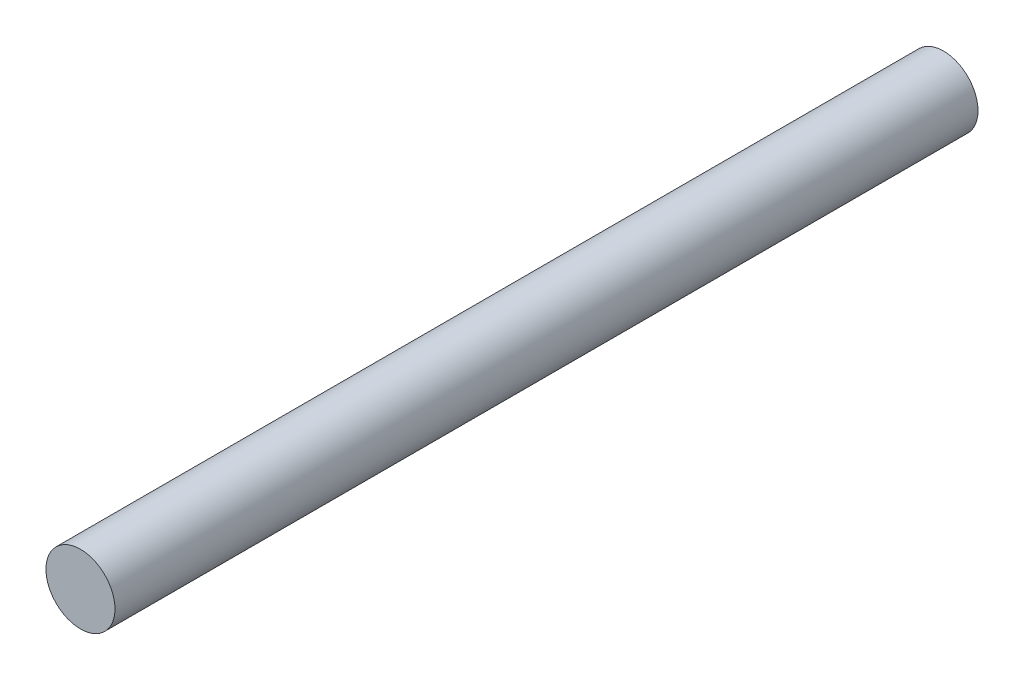
ISO-10303-21;
HEADER;
FILE_DESCRIPTION(('STEP AP214'),'2;1');
FILE_NAME('part.step','',(''),(''),'','','');
FILE_SCHEMA(('AUTOMOTIVE_DESIGN { 1 0 10303 214 1 1 1 1 }'));
ENDSEC;
DATA;
#1=APPLICATION_CONTEXT('core data for automotive mechanical design processes');
#2=APPLICATION_PROTOCOL_DEFINITION('international standard','automotive_design',2000,#1);
#3=PRODUCT_CONTEXT('',#1,'mechanical');
#4=PRODUCT('Part','Part','',(#3));
#5=PRODUCT_RELATED_PRODUCT_CATEGORY('part','',(#4));
#6=PRODUCT_DEFINITION_FORMATION('','',#4);
#7=PRODUCT_DEFINITION_CONTEXT('part definition',#1,'design');
#8=PRODUCT_DEFINITION('design','',#6,#7);
#9=PRODUCT_DEFINITION_SHAPE('','',#8);
#10=(LENGTH_UNIT() NAMED_UNIT(*) SI_UNIT(.MILLI.,.METRE.));
#11=(NAMED_UNIT(*) PLANE_ANGLE_UNIT() SI_UNIT($,.RADIAN.));
#12=(NAMED_UNIT(*) SI_UNIT($,.STERADIAN.) SOLID_ANGLE_UNIT());
#13=UNCERTAINTY_MEASURE_WITH_UNIT(LENGTH_MEASURE(1.E-05),#10,'distance_accuracy_value','');
#14=(GEOMETRIC_REPRESENTATION_CONTEXT(3) GLOBAL_UNCERTAINTY_ASSIGNED_CONTEXT((#13)) GLOBAL_UNIT_ASSIGNED_CONTEXT((#10,
#11,#12)) REPRESENTATION_CONTEXT('',''));
#15=CARTESIAN_POINT('',(0.,0.,0.));
#16=DIRECTION('',(0.,0.,1.));
#17=DIRECTION('',(1.,0.,0.));
#18=AXIS2_PLACEMENT_3D('',#15,#16,#17);
#19=CARTESIAN_POINT('',(0.,0.,75.));
#20=DIRECTION('',(0.,0.,-1.));
#21=DIRECTION('',(-1.,0.,0.));
#22=AXIS2_PLACEMENT_3D('',#19,#20,#21);
#23=CYLINDRICAL_SURFACE('',#22,3.);
#24=CARTESIAN_POINT('',(0.,0.,75.));
#25=DIRECTION('',(0.,0.,1.));
#26=DIRECTION('',(1.,0.,0.));
#27=AXIS2_PLACEMENT_3D('',#24,#25,#26);
#28=CIRCLE('',#27,3.);
#29=CARTESIAN_POINT('',(3.,0.,75.));
#30=VERTEX_POINT('',#29);
#31=EDGE_CURVE('E10',#30,#30,#28,.T.);
#32=ORIENTED_EDGE('',*,*,#31,.F.);
#33=EDGE_LOOP('',(#32));
#34=FACE_BOUND('',#33,.T.);
#35=CARTESIAN_POINT('',(0.,0.,0.));
#36=DIRECTION('',(0.,0.,1.));
#37=DIRECTION('',(1.,0.,0.));
#38=AXIS2_PLACEMENT_3D('',#35,#36,#37);
#39=CIRCLE('',#38,3.);
#40=CARTESIAN_POINT('',(3.,0.,0.));
#41=VERTEX_POINT('',#40);
#42=EDGE_CURVE('E36',#41,#41,#39,.T.);
#43=ORIENTED_EDGE('',*,*,#42,.T.);
#44=EDGE_LOOP('',(#43));
#45=FACE_BOUND('',#44,.T.);
#46=ADVANCED_FACE('F33',(#34,#45),#23,.T.);
#47=CARTESIAN_POINT('',(0.,0.,75.));
#48=DIRECTION('',(0.,0.,1.));
#49=DIRECTION('',(1.,0.,0.));
#50=AXIS2_PLACEMENT_3D('',#47,#48,#49);
#51=PLANE('',#50);
#52=ORIENTED_EDGE('',*,*,#31,.T.);
#53=EDGE_LOOP('',(#52));
#54=FACE_BOUND('',#53,.T.);
#55=ADVANCED_FACE('F48',(#54),#51,.T.);
#56=CARTESIAN_POINT('',(0.,0.,0.));
#57=DIRECTION('',(0.,0.,1.));
#58=DIRECTION('',(1.,0.,0.));
#59=AXIS2_PLACEMENT_3D('',#56,#57,#58);
#60=PLANE('',#59);
#61=ORIENTED_EDGE('',*,*,#42,.F.);
#62=EDGE_LOOP('',(#61));
#63=FACE_BOUND('',#62,.T.);
#64=ADVANCED_FACE('F46',(#63),#60,.F.);
#65=CLOSED_SHELL('',(#46,#55,#64));
#66=MANIFOLD_SOLID_BREP('B2',#65);
#67=ADVANCED_BREP_SHAPE_REPRESENTATION('',(#18,#66),#14);
#68=SHAPE_DEFINITION_REPRESENTATION(#9,#67);
ENDSEC;
END-ISO-10303-21;
